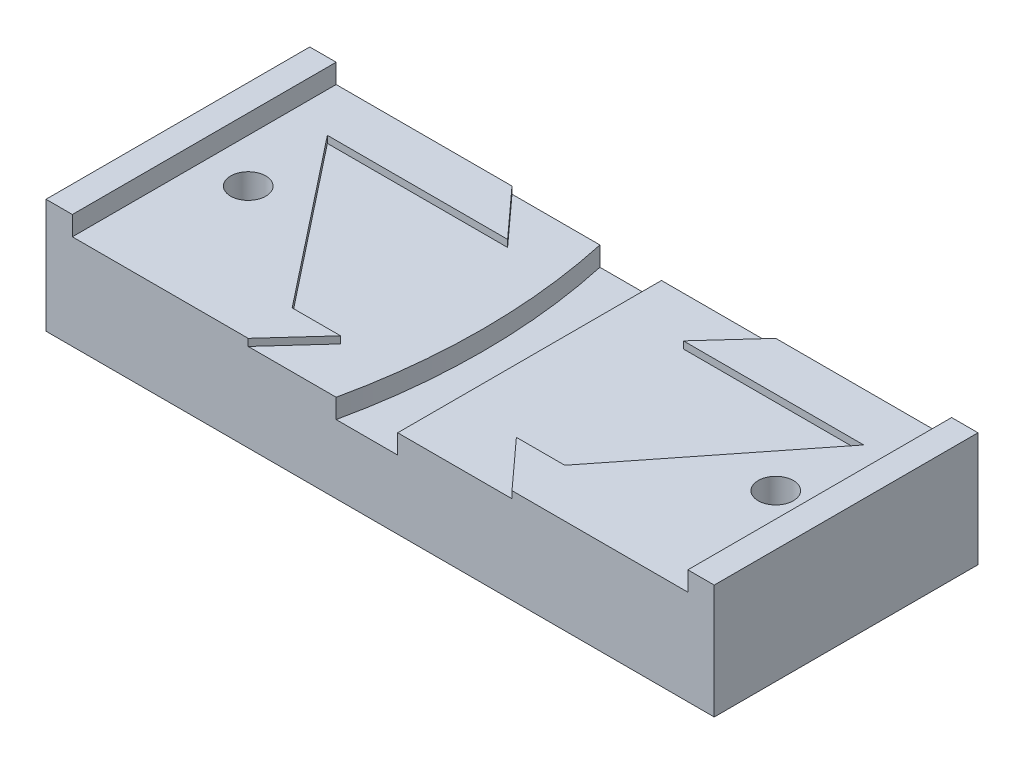
ISO-10303-21;
HEADER;
FILE_DESCRIPTION(('STEP AP214'),'2;1');
FILE_NAME('part.step','',(''),(''),'','','');
FILE_SCHEMA(('AUTOMOTIVE_DESIGN { 1 0 10303 214 1 1 1 1 }'));
ENDSEC;
DATA;
#1=APPLICATION_CONTEXT('core data for automotive mechanical design processes');
#2=APPLICATION_PROTOCOL_DEFINITION('international standard','automotive_design',2000,#1);
#3=PRODUCT_CONTEXT('',#1,'mechanical');
#4=PRODUCT('Part','Part','',(#3));
#5=PRODUCT_RELATED_PRODUCT_CATEGORY('part','',(#4));
#6=PRODUCT_DEFINITION_FORMATION('','',#4);
#7=PRODUCT_DEFINITION_CONTEXT('part definition',#1,'design');
#8=PRODUCT_DEFINITION('design','',#6,#7);
#9=PRODUCT_DEFINITION_SHAPE('','',#8);
#10=(LENGTH_UNIT() NAMED_UNIT(*) SI_UNIT(.MILLI.,.METRE.));
#11=(NAMED_UNIT(*) PLANE_ANGLE_UNIT() SI_UNIT($,.RADIAN.));
#12=(NAMED_UNIT(*) SI_UNIT($,.STERADIAN.) SOLID_ANGLE_UNIT());
#13=UNCERTAINTY_MEASURE_WITH_UNIT(LENGTH_MEASURE(1.E-05),#10,'distance_accuracy_value','');
#14=(GEOMETRIC_REPRESENTATION_CONTEXT(3) GLOBAL_UNCERTAINTY_ASSIGNED_CONTEXT((#13)) GLOBAL_UNIT_ASSIGNED_CONTEXT((#10,
#11,#12)) REPRESENTATION_CONTEXT('',''));
#15=CARTESIAN_POINT('',(0.,0.,0.));
#16=DIRECTION('',(0.,0.,1.));
#17=DIRECTION('',(1.,0.,0.));
#18=AXIS2_PLACEMENT_3D('',#15,#16,#17);
#19=CARTESIAN_POINT('',(0.,10.,0.));
#20=DIRECTION('',(0.,1.,0.));
#21=DIRECTION('',(0.,0.,1.));
#22=AXIS2_PLACEMENT_3D('',#19,#20,#21);
#23=PLANE('',#22);
#24=CARTESIAN_POINT('',(-73.3739716558867,10.,0.));
#25=DIRECTION('',(0.,-1.,0.));
#26=DIRECTION('',(0.,0.,-1.));
#27=AXIS2_PLACEMENT_3D('',#24,#25,#26);
#28=CIRCLE('',#27,70.);
#29=CARTESIAN_POINT('',(-5.,10.,-15.));
#30=VERTEX_POINT('',#29);
#31=CARTESIAN_POINT('',(-5.,10.,15.));
#32=VERTEX_POINT('',#31);
#33=EDGE_CURVE('E268',#30,#32,#28,.T.);
#34=ORIENTED_EDGE('',*,*,#33,.F.);
#35=DIRECTION('',(-1.,0.,0.));
#36=VECTOR('',#35,1.);
#37=CARTESIAN_POINT('',(35.,10.,-15.));
#38=LINE('',#37,#36);
#39=CARTESIAN_POINT('',(-15.,10.,-15.));
#40=VERTEX_POINT('',#39);
#41=EDGE_CURVE('E48',#30,#40,#38,.T.);
#42=ORIENTED_EDGE('',*,*,#41,.T.);
#43=DIRECTION('',(-0.672672793996312,0.,-0.739940073395944));
#44=VECTOR('',#43,1.);
#45=CARTESIAN_POINT('',(-0.746606334841628,10.,0.678733031674207));
#46=LINE('',#45,#44);
#47=CARTESIAN_POINT('',(-10.,10.,-9.50000000000001));
#48=VERTEX_POINT('',#47);
#49=EDGE_CURVE('E352',#48,#40,#46,.T.);
#50=ORIENTED_EDGE('',*,*,#49,.F.);
#51=DIRECTION('',(1.,0.,0.));
#52=VECTOR('',#51,1.);
#53=CARTESIAN_POINT('',(0.,10.,-9.50000000000001));
#54=LINE('',#53,#52);
#55=CARTESIAN_POINT('',(-30.5,10.,-9.50000000000001));
#56=VERTEX_POINT('',#55);
#57=EDGE_CURVE('E377',#56,#48,#54,.T.);
#58=ORIENTED_EDGE('',*,*,#57,.F.);
#59=DIRECTION('',(-0.619644288579021,0.,-0.784882765533426));
#60=VECTOR('',#59,1.);
#61=CARTESIAN_POINT('',(-14.1689419795222,10.,11.1860068259386));
#62=LINE('',#61,#60);
#63=CARTESIAN_POINT('',(-15.5,10.,9.5));
#64=VERTEX_POINT('',#63);
#65=EDGE_CURVE('E374',#64,#56,#62,.T.);
#66=ORIENTED_EDGE('',*,*,#65,.F.);
#67=DIRECTION('',(-1.,0.,0.));
#68=VECTOR('',#67,1.);
#69=CARTESIAN_POINT('',(0.,10.,9.49999999999999));
#70=LINE('',#69,#68);
#71=CARTESIAN_POINT('',(-10.,10.,9.5));
#72=VERTEX_POINT('',#71);
#73=EDGE_CURVE('E371',#72,#64,#70,.T.);
#74=ORIENTED_EDGE('',*,*,#73,.F.);
#75=DIRECTION('',(0.672672793996312,0.,-0.739940073395944));
#76=VECTOR('',#75,1.);
#77=CARTESIAN_POINT('',(-0.746606334841631,10.,-0.67873303167421));
#78=LINE('',#77,#76);
#79=CARTESIAN_POINT('',(-15.,10.,15.));
#80=VERTEX_POINT('',#79);
#81=EDGE_CURVE('E347',#80,#72,#78,.T.);
#82=ORIENTED_EDGE('',*,*,#81,.F.);
#83=DIRECTION('',(1.,0.,0.));
#84=VECTOR('',#83,1.);
#85=CARTESIAN_POINT('',(35.,10.,15.));
#86=LINE('',#85,#84);
#87=EDGE_CURVE('E400',#80,#32,#86,.T.);
#88=ORIENTED_EDGE('',*,*,#87,.T.);
#89=EDGE_LOOP('',(#34,#42,#50,#58,#66,#74,#82,#88));
#90=FACE_BOUND('',#89,.T.);
#91=ADVANCED_FACE('F39',(#90),#23,.T.);
#92=CARTESIAN_POINT('',(35.,10.,15.));
#93=DIRECTION('',(0.,0.,-1.));
#94=DIRECTION('',(-1.,0.,0.));
#95=AXIS2_PLACEMENT_3D('',#92,#93,#94);
#96=PLANE('',#95);
#97=DIRECTION('',(1.,0.,0.));
#98=VECTOR('',#97,1.);
#99=CARTESIAN_POINT('',(-5.,7.8,15.));
#100=LINE('',#99,#98);
#101=CARTESIAN_POINT('',(-5.,7.8,15.));
#102=VERTEX_POINT('',#101);
#103=CARTESIAN_POINT('',(2.,7.8,15.));
#104=VERTEX_POINT('',#103);
#105=EDGE_CURVE('E280',#102,#104,#100,.T.);
#106=ORIENTED_EDGE('',*,*,#105,.F.);
#107=DIRECTION('',(0.,1.,0.));
#108=VECTOR('',#107,1.);
#109=CARTESIAN_POINT('',(-5.,7.8,15.));
#110=LINE('',#109,#108);
#111=EDGE_CURVE('E290',#102,#32,#110,.T.);
#112=ORIENTED_EDGE('',*,*,#111,.T.);
#113=ORIENTED_EDGE('',*,*,#87,.F.);
#114=DIRECTION('',(0.,-1.,0.));
#115=VECTOR('',#114,1.);
#116=CARTESIAN_POINT('',(-15.,10.8,15.));
#117=LINE('',#116,#115);
#118=CARTESIAN_POINT('',(-15.,10.8,15.));
#119=VERTEX_POINT('',#118);
#120=EDGE_CURVE('E396',#119,#80,#117,.T.);
#121=ORIENTED_EDGE('',*,*,#120,.F.);
#122=DIRECTION('',(1.,0.,0.));
#123=VECTOR('',#122,1.);
#124=CARTESIAN_POINT('',(0.,10.8,15.));
#125=LINE('',#124,#123);
#126=CARTESIAN_POINT('',(-35.,10.8,15.));
#127=VERTEX_POINT('',#126);
#128=EDGE_CURVE('E348',#127,#119,#125,.T.);
#129=ORIENTED_EDGE('',*,*,#128,.F.);
#130=DIRECTION('',(0.,-1.,0.));
#131=VECTOR('',#130,1.);
#132=CARTESIAN_POINT('',(-35.,13.,15.));
#133=LINE('',#132,#131);
#134=CARTESIAN_POINT('',(-35.,13.,15.));
#135=VERTEX_POINT('',#134);
#136=EDGE_CURVE('E258',#135,#127,#133,.T.);
#137=ORIENTED_EDGE('',*,*,#136,.F.);
#138=DIRECTION('',(-1.,0.,0.));
#139=VECTOR('',#138,1.);
#140=CARTESIAN_POINT('',(0.,13.,15.));
#141=LINE('',#140,#139);
#142=CARTESIAN_POINT('',(-38.,13.,15.));
#143=VERTEX_POINT('',#142);
#144=EDGE_CURVE('E248',#135,#143,#141,.T.);
#145=ORIENTED_EDGE('',*,*,#144,.T.);
#146=DIRECTION('',(0.,-1.,0.));
#147=VECTOR('',#146,1.);
#148=CARTESIAN_POINT('',(-38.,13.,15.));
#149=LINE('',#148,#147);
#150=CARTESIAN_POINT('',(-38.,0.,15.));
#151=VERTEX_POINT('',#150);
#152=EDGE_CURVE('E254',#143,#151,#149,.T.);
#153=ORIENTED_EDGE('',*,*,#152,.T.);
#154=DIRECTION('',(1.,0.,0.));
#155=VECTOR('',#154,1.);
#156=CARTESIAN_POINT('',(35.,0.,15.));
#157=LINE('',#156,#155);
#158=CARTESIAN_POINT('',(38.,0.,15.));
#159=VERTEX_POINT('',#158);
#160=EDGE_CURVE('E399',#151,#159,#157,.T.);
#161=ORIENTED_EDGE('',*,*,#160,.T.);
#162=DIRECTION('',(0.,-1.,0.));
#163=VECTOR('',#162,1.);
#164=CARTESIAN_POINT('',(38.,13.,15.));
#165=LINE('',#164,#163);
#166=CARTESIAN_POINT('',(38.,13.,15.));
#167=VERTEX_POINT('',#166);
#168=EDGE_CURVE('E238',#167,#159,#165,.T.);
#169=ORIENTED_EDGE('',*,*,#168,.F.);
#170=DIRECTION('',(1.,0.,0.));
#171=VECTOR('',#170,1.);
#172=CARTESIAN_POINT('',(0.,13.,15.));
#173=LINE('',#172,#171);
#174=CARTESIAN_POINT('',(35.,13.,15.));
#175=VERTEX_POINT('',#174);
#176=EDGE_CURVE('E215',#175,#167,#173,.T.);
#177=ORIENTED_EDGE('',*,*,#176,.F.);
#178=DIRECTION('',(0.,-1.,0.));
#179=VECTOR('',#178,1.);
#180=CARTESIAN_POINT('',(35.,13.,15.));
#181=LINE('',#180,#179);
#182=CARTESIAN_POINT('',(35.,10.8,15.));
#183=VERTEX_POINT('',#182);
#184=EDGE_CURVE('E222',#175,#183,#181,.T.);
#185=ORIENTED_EDGE('',*,*,#184,.T.);
#186=DIRECTION('',(1.,0.,0.));
#187=VECTOR('',#186,1.);
#188=CARTESIAN_POINT('',(0.,10.8,15.));
#189=LINE('',#188,#187);
#190=CARTESIAN_POINT('',(15.,10.8,15.));
#191=VERTEX_POINT('',#190);
#192=EDGE_CURVE('E315',#191,#183,#189,.T.);
#193=ORIENTED_EDGE('',*,*,#192,.F.);
#194=DIRECTION('',(0.,-1.,0.));
#195=VECTOR('',#194,1.);
#196=CARTESIAN_POINT('',(15.,10.8,15.));
#197=LINE('',#196,#195);
#198=CARTESIAN_POINT('',(15.,10.,15.));
#199=VERTEX_POINT('',#198);
#200=EDGE_CURVE('E333',#191,#199,#197,.T.);
#201=ORIENTED_EDGE('',*,*,#200,.T.);
#202=CARTESIAN_POINT('',(2.,10.,15.));
#203=VERTEX_POINT('',#202);
#204=EDGE_CURVE('E402',#203,#199,#86,.T.);
#205=ORIENTED_EDGE('',*,*,#204,.F.);
#206=DIRECTION('',(0.,1.,0.));
#207=VECTOR('',#206,1.);
#208=CARTESIAN_POINT('',(2.,7.8,15.));
#209=LINE('',#208,#207);
#210=EDGE_CURVE('E56',#104,#203,#209,.T.);
#211=ORIENTED_EDGE('',*,*,#210,.F.);
#212=EDGE_LOOP('',(#106,#112,#113,#121,#129,#137,#145,#153,#161,#169,#177,#185,#193,#201,#205,#211));
#213=FACE_BOUND('',#212,.T.);
#214=ADVANCED_FACE('F41',(#213),#96,.F.);
#215=CARTESIAN_POINT('',(35.,10.,-15.));
#216=DIRECTION('',(0.,0.,1.));
#217=DIRECTION('',(1.,0.,0.));
#218=AXIS2_PLACEMENT_3D('',#215,#216,#217);
#219=PLANE('',#218);
#220=ORIENTED_EDGE('',*,*,#41,.F.);
#221=DIRECTION('',(0.,1.,0.));
#222=VECTOR('',#221,1.);
#223=CARTESIAN_POINT('',(-5.,7.8,-15.));
#224=LINE('',#223,#222);
#225=CARTESIAN_POINT('',(-5.,7.8,-15.));
#226=VERTEX_POINT('',#225);
#227=EDGE_CURVE('E293',#226,#30,#224,.T.);
#228=ORIENTED_EDGE('',*,*,#227,.F.);
#229=DIRECTION('',(-1.,0.,0.));
#230=VECTOR('',#229,1.);
#231=CARTESIAN_POINT('',(-5.,7.8,-15.));
#232=LINE('',#231,#230);
#233=CARTESIAN_POINT('',(2.,7.8,-15.));
#234=VERTEX_POINT('',#233);
#235=EDGE_CURVE('E287',#234,#226,#232,.T.);
#236=ORIENTED_EDGE('',*,*,#235,.F.);
#237=DIRECTION('',(0.,1.,0.));
#238=VECTOR('',#237,1.);
#239=CARTESIAN_POINT('',(2.,7.8,-15.));
#240=LINE('',#239,#238);
#241=CARTESIAN_POINT('',(2.,10.,-15.));
#242=VERTEX_POINT('',#241);
#243=EDGE_CURVE('E296',#234,#242,#240,.T.);
#244=ORIENTED_EDGE('',*,*,#243,.T.);
#245=CARTESIAN_POINT('',(15.,10.,-15.));
#246=VERTEX_POINT('',#245);
#247=EDGE_CURVE('E11',#246,#242,#38,.T.);
#248=ORIENTED_EDGE('',*,*,#247,.F.);
#249=DIRECTION('',(0.,-1.,0.));
#250=VECTOR('',#249,1.);
#251=CARTESIAN_POINT('',(15.,10.8,-15.));
#252=LINE('',#251,#250);
#253=CARTESIAN_POINT('',(15.,10.8,-15.));
#254=VERTEX_POINT('',#253);
#255=EDGE_CURVE('E321',#254,#246,#252,.T.);
#256=ORIENTED_EDGE('',*,*,#255,.F.);
#257=DIRECTION('',(-1.,0.,0.));
#258=VECTOR('',#257,1.);
#259=CARTESIAN_POINT('',(0.,10.8,-15.));
#260=LINE('',#259,#258);
#261=CARTESIAN_POINT('',(35.,10.8,-15.));
#262=VERTEX_POINT('',#261);
#263=EDGE_CURVE('E211',#262,#254,#260,.T.);
#264=ORIENTED_EDGE('',*,*,#263,.F.);
#265=DIRECTION('',(0.,-1.,0.));
#266=VECTOR('',#265,1.);
#267=CARTESIAN_POINT('',(35.,13.,-15.));
#268=LINE('',#267,#266);
#269=CARTESIAN_POINT('',(35.,13.,-15.));
#270=VERTEX_POINT('',#269);
#271=EDGE_CURVE('E203',#270,#262,#268,.T.);
#272=ORIENTED_EDGE('',*,*,#271,.F.);
#273=DIRECTION('',(1.,0.,0.));
#274=VECTOR('',#273,1.);
#275=CARTESIAN_POINT('',(0.,13.,-15.));
#276=LINE('',#275,#274);
#277=CARTESIAN_POINT('',(38.,13.,-15.));
#278=VERTEX_POINT('',#277);
#279=EDGE_CURVE('E209',#270,#278,#276,.T.);
#280=ORIENTED_EDGE('',*,*,#279,.T.);
#281=DIRECTION('',(0.,-1.,0.));
#282=VECTOR('',#281,1.);
#283=CARTESIAN_POINT('',(38.,13.,-15.));
#284=LINE('',#283,#282);
#285=CARTESIAN_POINT('',(38.,0.,-15.));
#286=VERTEX_POINT('',#285);
#287=EDGE_CURVE('E214',#278,#286,#284,.T.);
#288=ORIENTED_EDGE('',*,*,#287,.T.);
#289=DIRECTION('',(-1.,0.,0.));
#290=VECTOR('',#289,1.);
#291=CARTESIAN_POINT('',(35.,0.,-15.));
#292=LINE('',#291,#290);
#293=CARTESIAN_POINT('',(-38.,0.,-15.));
#294=VERTEX_POINT('',#293);
#295=EDGE_CURVE('E43',#286,#294,#292,.T.);
#296=ORIENTED_EDGE('',*,*,#295,.T.);
#297=DIRECTION('',(0.,-1.,0.));
#298=VECTOR('',#297,1.);
#299=CARTESIAN_POINT('',(-38.,13.,-15.));
#300=LINE('',#299,#298);
#301=CARTESIAN_POINT('',(-38.,13.,-15.));
#302=VERTEX_POINT('',#301);
#303=EDGE_CURVE('E251',#302,#294,#300,.T.);
#304=ORIENTED_EDGE('',*,*,#303,.F.);
#305=DIRECTION('',(-1.,0.,0.));
#306=VECTOR('',#305,1.);
#307=CARTESIAN_POINT('',(0.,13.,-15.));
#308=LINE('',#307,#306);
#309=CARTESIAN_POINT('',(-35.,13.,-15.));
#310=VERTEX_POINT('',#309);
#311=EDGE_CURVE('E244',#310,#302,#308,.T.);
#312=ORIENTED_EDGE('',*,*,#311,.F.);
#313=DIRECTION('',(0.,-1.,0.));
#314=VECTOR('',#313,1.);
#315=CARTESIAN_POINT('',(-35.,13.,-15.));
#316=LINE('',#315,#314);
#317=CARTESIAN_POINT('',(-35.,10.8,-15.));
#318=VERTEX_POINT('',#317);
#319=EDGE_CURVE('E260',#310,#318,#316,.T.);
#320=ORIENTED_EDGE('',*,*,#319,.T.);
#321=DIRECTION('',(-1.,0.,0.));
#322=VECTOR('',#321,1.);
#323=CARTESIAN_POINT('',(0.,10.8,-15.));
#324=LINE('',#323,#322);
#325=CARTESIAN_POINT('',(-15.,10.8,-15.));
#326=VERTEX_POINT('',#325);
#327=EDGE_CURVE('E362',#326,#318,#324,.T.);
#328=ORIENTED_EDGE('',*,*,#327,.F.);
#329=DIRECTION('',(0.,-1.,0.));
#330=VECTOR('',#329,1.);
#331=CARTESIAN_POINT('',(-15.,10.8,-15.));
#332=LINE('',#331,#330);
#333=EDGE_CURVE('E368',#326,#40,#332,.T.);
#334=ORIENTED_EDGE('',*,*,#333,.T.);
#335=EDGE_LOOP('',(#220,#228,#236,#244,#248,#256,#264,#272,#280,#288,#296,#304,#312,#320,#328,#334));
#336=FACE_BOUND('',#335,.T.);
#337=ADVANCED_FACE('F206',(#336),#219,.F.);
#338=DIRECTION('',(0.,0.,-1.));
#339=VECTOR('',#338,1.);
#340=CARTESIAN_POINT('',(2.,10.,-15.));
#341=LINE('',#340,#339);
#342=EDGE_CURVE('E281',#203,#242,#341,.T.);
#343=ORIENTED_EDGE('',*,*,#342,.F.);
#344=ORIENTED_EDGE('',*,*,#204,.T.);
#345=DIRECTION('',(-0.672672793996313,0.,-0.739940073395944));
#346=VECTOR('',#345,1.);
#347=CARTESIAN_POINT('',(0.74660633484163,10.,-0.678733031674209));
#348=LINE('',#347,#346);
#349=CARTESIAN_POINT('',(10.,10.,9.49999999999999));
#350=VERTEX_POINT('',#349);
#351=EDGE_CURVE('E306',#199,#350,#348,.T.);
#352=ORIENTED_EDGE('',*,*,#351,.T.);
#353=DIRECTION('',(-1.,0.,0.));
#354=VECTOR('',#353,1.);
#355=CARTESIAN_POINT('',(0.,10.,9.49999999999999));
#356=LINE('',#355,#354);
#357=CARTESIAN_POINT('',(15.5,10.,9.49999999999999));
#358=VERTEX_POINT('',#357);
#359=EDGE_CURVE('E327',#358,#350,#356,.T.);
#360=ORIENTED_EDGE('',*,*,#359,.F.);
#361=DIRECTION('',(-0.619644288579021,0.,0.784882765533427));
#362=VECTOR('',#361,1.);
#363=CARTESIAN_POINT('',(14.1689419795222,10.,11.1860068259386));
#364=LINE('',#363,#362);
#365=CARTESIAN_POINT('',(30.5,10.,-9.50000000000001));
#366=VERTEX_POINT('',#365);
#367=EDGE_CURVE('E324',#366,#358,#364,.T.);
#368=ORIENTED_EDGE('',*,*,#367,.F.);
#369=DIRECTION('',(1.,0.,0.));
#370=VECTOR('',#369,1.);
#371=CARTESIAN_POINT('',(0.,10.,-9.50000000000001));
#372=LINE('',#371,#370);
#373=CARTESIAN_POINT('',(10.,10.,-9.50000000000001));
#374=VERTEX_POINT('',#373);
#375=EDGE_CURVE('E64',#374,#366,#372,.T.);
#376=ORIENTED_EDGE('',*,*,#375,.F.);
#377=DIRECTION('',(0.672672793996312,0.,-0.739940073395944));
#378=VECTOR('',#377,1.);
#379=CARTESIAN_POINT('',(0.746606334841628,10.,0.678733031674207));
#380=LINE('',#379,#378);
#381=EDGE_CURVE('E295',#374,#246,#380,.T.);
#382=ORIENTED_EDGE('',*,*,#381,.T.);
#383=ORIENTED_EDGE('',*,*,#247,.T.);
#384=EDGE_LOOP('',(#343,#344,#352,#360,#368,#376,#382,#383));
#385=FACE_BOUND('',#384,.T.);
#386=ADVANCED_FACE('F407',(#385),#23,.T.);
#387=CARTESIAN_POINT('',(0.,0.,0.));
#388=DIRECTION('',(0.,1.,0.));
#389=DIRECTION('',(0.,0.,1.));
#390=AXIS2_PLACEMENT_3D('',#387,#388,#389);
#391=PLANE('',#390);
#392=ORIENTED_EDGE('',*,*,#160,.F.);
#393=DIRECTION('',(0.,0.,1.));
#394=VECTOR('',#393,1.);
#395=CARTESIAN_POINT('',(-38.,0.,0.));
#396=LINE('',#395,#394);
#397=EDGE_CURVE('E237',#294,#151,#396,.T.);
#398=ORIENTED_EDGE('',*,*,#397,.F.);
#399=ORIENTED_EDGE('',*,*,#295,.F.);
#400=DIRECTION('',(0.,0.,1.));
#401=VECTOR('',#400,1.);
#402=CARTESIAN_POINT('',(38.,0.,0.));
#403=LINE('',#402,#401);
#404=EDGE_CURVE('E224',#286,#159,#403,.T.);
#405=ORIENTED_EDGE('',*,*,#404,.T.);
#406=EDGE_LOOP('',(#392,#398,#399,#405));
#407=FACE_BOUND('',#406,.T.);
#408=ADVANCED_FACE('F466',(#407),#391,.F.);
#409=CARTESIAN_POINT('',(-0.746606334841631,10.8,-0.67873303167421));
#410=DIRECTION('',(-0.739940073395944,0.,-0.672672793996312));
#411=DIRECTION('',(-0.672672793996312,0.,0.739940073395944));
#412=AXIS2_PLACEMENT_3D('',#409,#410,#411);
#413=PLANE('',#412);
#414=ORIENTED_EDGE('',*,*,#81,.T.);
#415=DIRECTION('',(0.,-1.,0.));
#416=VECTOR('',#415,1.);
#417=CARTESIAN_POINT('',(-10.,10.8,9.5));
#418=LINE('',#417,#416);
#419=CARTESIAN_POINT('',(-10.,10.8,9.5));
#420=VERTEX_POINT('',#419);
#421=EDGE_CURVE('E393',#420,#72,#418,.T.);
#422=ORIENTED_EDGE('',*,*,#421,.F.);
#423=DIRECTION('',(0.672672793996312,0.,-0.739940073395944));
#424=VECTOR('',#423,1.);
#425=CARTESIAN_POINT('',(-0.746606334841631,10.8,-0.67873303167421));
#426=LINE('',#425,#424);
#427=EDGE_CURVE('E351',#119,#420,#426,.T.);
#428=ORIENTED_EDGE('',*,*,#427,.F.);
#429=ORIENTED_EDGE('',*,*,#120,.T.);
#430=EDGE_LOOP('',(#414,#422,#428,#429));
#431=FACE_BOUND('',#430,.T.);
#432=ADVANCED_FACE('F442',(#431),#413,.F.);
#433=CARTESIAN_POINT('',(0.,10.8,9.49999999999999));
#434=DIRECTION('',(0.,0.,1.));
#435=DIRECTION('',(1.,0.,0.));
#436=AXIS2_PLACEMENT_3D('',#433,#434,#435);
#437=PLANE('',#436);
#438=ORIENTED_EDGE('',*,*,#73,.T.);
#439=DIRECTION('',(0.,-1.,0.));
#440=VECTOR('',#439,1.);
#441=CARTESIAN_POINT('',(-15.5,10.8,9.5));
#442=LINE('',#441,#440);
#443=CARTESIAN_POINT('',(-15.5,10.8,9.5));
#444=VERTEX_POINT('',#443);
#445=EDGE_CURVE('E390',#444,#64,#442,.T.);
#446=ORIENTED_EDGE('',*,*,#445,.F.);
#447=DIRECTION('',(-1.,0.,0.));
#448=VECTOR('',#447,1.);
#449=CARTESIAN_POINT('',(0.,10.8,9.49999999999999));
#450=LINE('',#449,#448);
#451=EDGE_CURVE('E354',#420,#444,#450,.T.);
#452=ORIENTED_EDGE('',*,*,#451,.F.);
#453=ORIENTED_EDGE('',*,*,#421,.T.);
#454=EDGE_LOOP('',(#438,#446,#452,#453));
#455=FACE_BOUND('',#454,.T.);
#456=ADVANCED_FACE('F445',(#455),#437,.F.);
#457=CARTESIAN_POINT('',(-14.1689419795222,10.8,11.1860068259386));
#458=DIRECTION('',(-0.784882765533426,0.,0.619644288579021));
#459=DIRECTION('',(0.619644288579021,0.,0.784882765533426));
#460=AXIS2_PLACEMENT_3D('',#457,#458,#459);
#461=PLANE('',#460);
#462=ORIENTED_EDGE('',*,*,#65,.T.);
#463=DIRECTION('',(0.,-1.,0.));
#464=VECTOR('',#463,1.);
#465=CARTESIAN_POINT('',(-30.5,10.8,-9.50000000000001));
#466=LINE('',#465,#464);
#467=CARTESIAN_POINT('',(-30.5,10.8,-9.50000000000001));
#468=VERTEX_POINT('',#467);
#469=EDGE_CURVE('E387',#468,#56,#466,.T.);
#470=ORIENTED_EDGE('',*,*,#469,.F.);
#471=DIRECTION('',(-0.619644288579021,0.,-0.784882765533426));
#472=VECTOR('',#471,1.);
#473=CARTESIAN_POINT('',(-14.1689419795222,10.8,11.1860068259386));
#474=LINE('',#473,#472);
#475=EDGE_CURVE('E356',#444,#468,#474,.T.);
#476=ORIENTED_EDGE('',*,*,#475,.F.);
#477=ORIENTED_EDGE('',*,*,#445,.T.);
#478=EDGE_LOOP('',(#462,#470,#476,#477));
#479=FACE_BOUND('',#478,.T.);
#480=ADVANCED_FACE('F653',(#479),#461,.F.);
#481=CARTESIAN_POINT('',(0.,10.8,-9.50000000000001));
#482=DIRECTION('',(0.,0.,-1.));
#483=DIRECTION('',(-1.,0.,0.));
#484=AXIS2_PLACEMENT_3D('',#481,#482,#483);
#485=PLANE('',#484);
#486=ORIENTED_EDGE('',*,*,#57,.T.);
#487=DIRECTION('',(0.,-1.,0.));
#488=VECTOR('',#487,1.);
#489=CARTESIAN_POINT('',(-10.,10.8,-9.50000000000001));
#490=LINE('',#489,#488);
#491=CARTESIAN_POINT('',(-10.,10.8,-9.50000000000001));
#492=VERTEX_POINT('',#491);
#493=EDGE_CURVE('E384',#492,#48,#490,.T.);
#494=ORIENTED_EDGE('',*,*,#493,.F.);
#495=DIRECTION('',(1.,0.,0.));
#496=VECTOR('',#495,1.);
#497=CARTESIAN_POINT('',(0.,10.8,-9.50000000000001));
#498=LINE('',#497,#496);
#499=EDGE_CURVE('E358',#468,#492,#498,.T.);
#500=ORIENTED_EDGE('',*,*,#499,.F.);
#501=ORIENTED_EDGE('',*,*,#469,.T.);
#502=EDGE_LOOP('',(#486,#494,#500,#501));
#503=FACE_BOUND('',#502,.T.);
#504=ADVANCED_FACE('F642',(#503),#485,.F.);
#505=CARTESIAN_POINT('',(-0.746606334841628,10.8,0.678733031674207));
#506=DIRECTION('',(-0.739940073395944,0.,0.672672793996312));
#507=DIRECTION('',(0.672672793996312,0.,0.739940073395944));
#508=AXIS2_PLACEMENT_3D('',#505,#506,#507);
#509=PLANE('',#508);
#510=ORIENTED_EDGE('',*,*,#49,.T.);
#511=ORIENTED_EDGE('',*,*,#333,.F.);
#512=DIRECTION('',(-0.672672793996312,0.,-0.739940073395944));
#513=VECTOR('',#512,1.);
#514=CARTESIAN_POINT('',(-0.746606334841628,10.8,0.678733031674207));
#515=LINE('',#514,#513);
#516=EDGE_CURVE('E360',#492,#326,#515,.T.);
#517=ORIENTED_EDGE('',*,*,#516,.F.);
#518=ORIENTED_EDGE('',*,*,#493,.T.);
#519=EDGE_LOOP('',(#510,#511,#517,#518));
#520=FACE_BOUND('',#519,.T.);
#521=ADVANCED_FACE('F637',(#520),#509,.F.);
#522=CARTESIAN_POINT('',(0.,10.8,0.));
#523=DIRECTION('',(0.,1.,0.));
#524=DIRECTION('',(0.,0.,1.));
#525=AXIS2_PLACEMENT_3D('',#522,#523,#524);
#526=PLANE('',#525);
#527=CARTESIAN_POINT('',(-30.,10.8,0.));
#528=DIRECTION('',(0.,1.,0.));
#529=DIRECTION('',(0.,0.,1.));
#530=AXIS2_PLACEMENT_3D('',#527,#528,#529);
#531=CIRCLE('',#530,2.);
#532=CARTESIAN_POINT('',(-30.,10.8,2.));
#533=VERTEX_POINT('',#532);
#534=EDGE_CURVE('E269',#533,#533,#531,.T.);
#535=ORIENTED_EDGE('',*,*,#534,.F.);
#536=EDGE_LOOP('',(#535));
#537=FACE_BOUND('',#536,.T.);
#538=ORIENTED_EDGE('',*,*,#128,.T.);
#539=ORIENTED_EDGE('',*,*,#427,.T.);
#540=ORIENTED_EDGE('',*,*,#451,.T.);
#541=ORIENTED_EDGE('',*,*,#475,.T.);
#542=ORIENTED_EDGE('',*,*,#499,.T.);
#543=ORIENTED_EDGE('',*,*,#516,.T.);
#544=ORIENTED_EDGE('',*,*,#327,.T.);
#545=DIRECTION('',(0.,0.,1.));
#546=VECTOR('',#545,1.);
#547=CARTESIAN_POINT('',(-35.,10.8,0.));
#548=LINE('',#547,#546);
#549=EDGE_CURVE('E365',#318,#127,#548,.T.);
#550=ORIENTED_EDGE('',*,*,#549,.T.);
#551=EDGE_LOOP('',(#538,#539,#540,#541,#542,#543,#544,#550));
#552=FACE_BOUND('',#551,.T.);
#553=ADVANCED_FACE('F449',(#537,#552),#526,.T.);
#554=CARTESIAN_POINT('',(0.746606334841628,10.8,0.678733031674207));
#555=DIRECTION('',(-0.739940073395944,0.,-0.672672793996312));
#556=DIRECTION('',(-0.672672793996312,0.,0.739940073395944));
#557=AXIS2_PLACEMENT_3D('',#554,#555,#556);
#558=PLANE('',#557);
#559=ORIENTED_EDGE('',*,*,#381,.F.);
#560=DIRECTION('',(0.,-1.,0.));
#561=VECTOR('',#560,1.);
#562=CARTESIAN_POINT('',(10.,10.8,-9.50000000000001));
#563=LINE('',#562,#561);
#564=CARTESIAN_POINT('',(10.,10.8,-9.50000000000001));
#565=VERTEX_POINT('',#564);
#566=EDGE_CURVE('E345',#565,#374,#563,.T.);
#567=ORIENTED_EDGE('',*,*,#566,.F.);
#568=DIRECTION('',(0.672672793996312,0.,-0.739940073395944));
#569=VECTOR('',#568,1.);
#570=CARTESIAN_POINT('',(0.746606334841628,10.8,0.678733031674207));
#571=LINE('',#570,#569);
#572=EDGE_CURVE('E302',#565,#254,#571,.T.);
#573=ORIENTED_EDGE('',*,*,#572,.T.);
#574=ORIENTED_EDGE('',*,*,#255,.T.);
#575=EDGE_LOOP('',(#559,#567,#573,#574));
#576=FACE_BOUND('',#575,.T.);
#577=ADVANCED_FACE('F429',(#576),#558,.T.);
#578=CARTESIAN_POINT('',(0.,10.8,-9.50000000000001));
#579=DIRECTION('',(0.,0.,-1.));
#580=DIRECTION('',(-1.,0.,0.));
#581=AXIS2_PLACEMENT_3D('',#578,#579,#580);
#582=PLANE('',#581);
#583=ORIENTED_EDGE('',*,*,#375,.T.);
#584=DIRECTION('',(0.,-1.,0.));
#585=VECTOR('',#584,1.);
#586=CARTESIAN_POINT('',(30.5,10.8,-9.50000000000001));
#587=LINE('',#586,#585);
#588=CARTESIAN_POINT('',(30.5,10.8,-9.50000000000001));
#589=VERTEX_POINT('',#588);
#590=EDGE_CURVE('E342',#589,#366,#587,.T.);
#591=ORIENTED_EDGE('',*,*,#590,.F.);
#592=DIRECTION('',(1.,0.,0.));
#593=VECTOR('',#592,1.);
#594=CARTESIAN_POINT('',(0.,10.8,-9.50000000000001));
#595=LINE('',#594,#593);
#596=EDGE_CURVE('E305',#565,#589,#595,.T.);
#597=ORIENTED_EDGE('',*,*,#596,.F.);
#598=ORIENTED_EDGE('',*,*,#566,.T.);
#599=EDGE_LOOP('',(#583,#591,#597,#598));
#600=FACE_BOUND('',#599,.T.);
#601=ADVANCED_FACE('F425',(#600),#582,.F.);
#602=CARTESIAN_POINT('',(14.1689419795222,10.8,11.1860068259386));
#603=DIRECTION('',(0.784882765533426,0.,0.619644288579021));
#604=DIRECTION('',(0.619644288579021,0.,-0.784882765533426));
#605=AXIS2_PLACEMENT_3D('',#602,#603,#604);
#606=PLANE('',#605);
#607=ORIENTED_EDGE('',*,*,#367,.T.);
#608=DIRECTION('',(0.,-1.,0.));
#609=VECTOR('',#608,1.);
#610=CARTESIAN_POINT('',(15.5,10.8,9.49999999999999));
#611=LINE('',#610,#609);
#612=CARTESIAN_POINT('',(15.5,10.8,9.49999999999999));
#613=VERTEX_POINT('',#612);
#614=EDGE_CURVE('E339',#613,#358,#611,.T.);
#615=ORIENTED_EDGE('',*,*,#614,.F.);
#616=DIRECTION('',(-0.619644288579021,0.,0.784882765533427));
#617=VECTOR('',#616,1.);
#618=CARTESIAN_POINT('',(14.1689419795222,10.8,11.1860068259386));
#619=LINE('',#618,#617);
#620=EDGE_CURVE('E308',#589,#613,#619,.T.);
#621=ORIENTED_EDGE('',*,*,#620,.F.);
#622=ORIENTED_EDGE('',*,*,#590,.T.);
#623=EDGE_LOOP('',(#607,#615,#621,#622));
#624=FACE_BOUND('',#623,.T.);
#625=ADVANCED_FACE('F420',(#624),#606,.F.);
#626=CARTESIAN_POINT('',(0.,10.8,9.49999999999999));
#627=DIRECTION('',(0.,0.,1.));
#628=DIRECTION('',(1.,0.,0.));
#629=AXIS2_PLACEMENT_3D('',#626,#627,#628);
#630=PLANE('',#629);
#631=ORIENTED_EDGE('',*,*,#359,.T.);
#632=DIRECTION('',(0.,-1.,0.));
#633=VECTOR('',#632,1.);
#634=CARTESIAN_POINT('',(10.,10.8,9.49999999999999));
#635=LINE('',#634,#633);
#636=CARTESIAN_POINT('',(10.,10.8,9.49999999999999));
#637=VERTEX_POINT('',#636);
#638=EDGE_CURVE('E336',#637,#350,#635,.T.);
#639=ORIENTED_EDGE('',*,*,#638,.F.);
#640=DIRECTION('',(-1.,0.,0.));
#641=VECTOR('',#640,1.);
#642=CARTESIAN_POINT('',(0.,10.8,9.49999999999999));
#643=LINE('',#642,#641);
#644=EDGE_CURVE('E310',#613,#637,#643,.T.);
#645=ORIENTED_EDGE('',*,*,#644,.F.);
#646=ORIENTED_EDGE('',*,*,#614,.T.);
#647=EDGE_LOOP('',(#631,#639,#645,#646));
#648=FACE_BOUND('',#647,.T.);
#649=ADVANCED_FACE('F417',(#648),#630,.F.);
#650=CARTESIAN_POINT('',(0.74660633484163,10.8,-0.678733031674209));
#651=DIRECTION('',(-0.739940073395943,0.,0.672672793996313));
#652=DIRECTION('',(0.672672793996313,0.,0.739940073395943));
#653=AXIS2_PLACEMENT_3D('',#650,#651,#652);
#654=PLANE('',#653);
#655=ORIENTED_EDGE('',*,*,#351,.F.);
#656=ORIENTED_EDGE('',*,*,#200,.F.);
#657=DIRECTION('',(-0.672672793996313,0.,-0.739940073395944));
#658=VECTOR('',#657,1.);
#659=CARTESIAN_POINT('',(0.74660633484163,10.8,-0.678733031674209));
#660=LINE('',#659,#658);
#661=EDGE_CURVE('E312',#191,#637,#660,.T.);
#662=ORIENTED_EDGE('',*,*,#661,.T.);
#663=ORIENTED_EDGE('',*,*,#638,.T.);
#664=EDGE_LOOP('',(#655,#656,#662,#663));
#665=FACE_BOUND('',#664,.T.);
#666=ADVANCED_FACE('F413',(#665),#654,.T.);
#667=CARTESIAN_POINT('',(0.,10.8,0.));
#668=DIRECTION('',(0.,1.,0.));
#669=DIRECTION('',(0.,0.,1.));
#670=AXIS2_PLACEMENT_3D('',#667,#668,#669);
#671=PLANE('',#670);
#672=CARTESIAN_POINT('',(30.,10.8,0.));
#673=DIRECTION('',(0.,1.,0.));
#674=DIRECTION('',(0.,0.,1.));
#675=AXIS2_PLACEMENT_3D('',#672,#673,#674);
#676=CIRCLE('',#675,2.);
#677=CARTESIAN_POINT('',(30.,10.8,1.99999999999999));
#678=VERTEX_POINT('',#677);
#679=EDGE_CURVE('E272',#678,#678,#676,.T.);
#680=ORIENTED_EDGE('',*,*,#679,.F.);
#681=EDGE_LOOP('',(#680));
#682=FACE_BOUND('',#681,.T.);
#683=ORIENTED_EDGE('',*,*,#572,.F.);
#684=ORIENTED_EDGE('',*,*,#596,.T.);
#685=ORIENTED_EDGE('',*,*,#620,.T.);
#686=ORIENTED_EDGE('',*,*,#644,.T.);
#687=ORIENTED_EDGE('',*,*,#661,.F.);
#688=ORIENTED_EDGE('',*,*,#192,.T.);
#689=DIRECTION('',(0.,0.,-1.));
#690=VECTOR('',#689,1.);
#691=CARTESIAN_POINT('',(35.,10.8,0.));
#692=LINE('',#691,#690);
#693=EDGE_CURVE('E318',#183,#262,#692,.T.);
#694=ORIENTED_EDGE('',*,*,#693,.T.);
#695=ORIENTED_EDGE('',*,*,#263,.T.);
#696=EDGE_LOOP('',(#683,#684,#685,#686,#687,#688,#694,#695));
#697=FACE_BOUND('',#696,.T.);
#698=ADVANCED_FACE('F471',(#682,#697),#671,.T.);
#699=CARTESIAN_POINT('',(-73.3739716558867,7.8,0.));
#700=DIRECTION('',(0.,1.,0.));
#701=DIRECTION('',(0.,0.,1.));
#702=AXIS2_PLACEMENT_3D('',#699,#700,#701);
#703=CYLINDRICAL_SURFACE('',#702,70.);
#704=ORIENTED_EDGE('',*,*,#33,.T.);
#705=ORIENTED_EDGE('',*,*,#111,.F.);
#706=CARTESIAN_POINT('',(-73.3739716558867,7.8,0.));
#707=DIRECTION('',(0.,-1.,0.));
#708=DIRECTION('',(0.,0.,-1.));
#709=AXIS2_PLACEMENT_3D('',#706,#707,#708);
#710=CIRCLE('',#709,70.);
#711=EDGE_CURVE('E277',#226,#102,#710,.T.);
#712=ORIENTED_EDGE('',*,*,#711,.F.);
#713=ORIENTED_EDGE('',*,*,#227,.T.);
#714=EDGE_LOOP('',(#704,#705,#712,#713));
#715=FACE_BOUND('',#714,.T.);
#716=ADVANCED_FACE('F473',(#715),#703,.T.);
#717=CARTESIAN_POINT('',(2.,7.8,-15.));
#718=DIRECTION('',(1.,0.,0.));
#719=DIRECTION('',(0.,0.,-1.));
#720=AXIS2_PLACEMENT_3D('',#717,#718,#719);
#721=PLANE('',#720);
#722=ORIENTED_EDGE('',*,*,#342,.T.);
#723=ORIENTED_EDGE('',*,*,#243,.F.);
#724=DIRECTION('',(0.,0.,-1.));
#725=VECTOR('',#724,1.);
#726=CARTESIAN_POINT('',(2.,7.8,-15.));
#727=LINE('',#726,#725);
#728=EDGE_CURVE('E284',#104,#234,#727,.T.);
#729=ORIENTED_EDGE('',*,*,#728,.F.);
#730=ORIENTED_EDGE('',*,*,#210,.T.);
#731=EDGE_LOOP('',(#722,#723,#729,#730));
#732=FACE_BOUND('',#731,.T.);
#733=ADVANCED_FACE('F432',(#732),#721,.F.);
#734=CARTESIAN_POINT('',(-73.3739716558867,7.8,0.));
#735=DIRECTION('',(0.,-1.,0.));
#736=DIRECTION('',(0.,0.,-1.));
#737=AXIS2_PLACEMENT_3D('',#734,#735,#736);
#738=PLANE('',#737);
#739=ORIENTED_EDGE('',*,*,#711,.T.);
#740=ORIENTED_EDGE('',*,*,#105,.T.);
#741=ORIENTED_EDGE('',*,*,#728,.T.);
#742=ORIENTED_EDGE('',*,*,#235,.T.);
#743=EDGE_LOOP('',(#739,#740,#741,#742));
#744=FACE_BOUND('',#743,.T.);
#745=ADVANCED_FACE('F434',(#744),#738,.F.);
#746=CARTESIAN_POINT('',(30.,2.8,0.));
#747=DIRECTION('',(0.,1.,0.));
#748=DIRECTION('',(0.,0.,1.));
#749=AXIS2_PLACEMENT_3D('',#746,#747,#748);
#750=CYLINDRICAL_SURFACE('',#749,2.);
#751=CARTESIAN_POINT('',(30.,2.8,0.));
#752=DIRECTION('',(0.,1.,0.));
#753=DIRECTION('',(0.,0.,1.));
#754=AXIS2_PLACEMENT_3D('',#751,#752,#753);
#755=CIRCLE('',#754,2.);
#756=CARTESIAN_POINT('',(30.,2.8,1.99999999999999));
#757=VERTEX_POINT('',#756);
#758=EDGE_CURVE('E257',#757,#757,#755,.T.);
#759=ORIENTED_EDGE('',*,*,#758,.F.);
#760=EDGE_LOOP('',(#759));
#761=FACE_BOUND('',#760,.T.);
#762=ORIENTED_EDGE('',*,*,#679,.T.);
#763=EDGE_LOOP('',(#762));
#764=FACE_BOUND('',#763,.T.);
#765=ADVANCED_FACE('F537',(#761,#764),#750,.F.);
#766=CARTESIAN_POINT('',(30.,2.8,0.));
#767=DIRECTION('',(0.,1.,0.));
#768=DIRECTION('',(0.,0.,1.));
#769=AXIS2_PLACEMENT_3D('',#766,#767,#768);
#770=PLANE('',#769);
#771=ORIENTED_EDGE('',*,*,#758,.T.);
#772=EDGE_LOOP('',(#771));
#773=FACE_BOUND('',#772,.T.);
#774=ADVANCED_FACE('F526',(#773),#770,.T.);
#775=CARTESIAN_POINT('',(-30.,2.8,0.));
#776=DIRECTION('',(0.,1.,0.));
#777=DIRECTION('',(0.,0.,1.));
#778=AXIS2_PLACEMENT_3D('',#775,#776,#777);
#779=CYLINDRICAL_SURFACE('',#778,2.);
#780=CARTESIAN_POINT('',(-30.,2.8,0.));
#781=DIRECTION('',(0.,1.,0.));
#782=DIRECTION('',(0.,0.,1.));
#783=AXIS2_PLACEMENT_3D('',#780,#781,#782);
#784=CIRCLE('',#783,2.);
#785=CARTESIAN_POINT('',(-30.,2.8,2.));
#786=VERTEX_POINT('',#785);
#787=EDGE_CURVE('E265',#786,#786,#784,.T.);
#788=ORIENTED_EDGE('',*,*,#787,.F.);
#789=EDGE_LOOP('',(#788));
#790=FACE_BOUND('',#789,.T.);
#791=ORIENTED_EDGE('',*,*,#534,.T.);
#792=EDGE_LOOP('',(#791));
#793=FACE_BOUND('',#792,.T.);
#794=ADVANCED_FACE('F514',(#790,#793),#779,.F.);
#795=CARTESIAN_POINT('',(-30.,2.8,0.));
#796=DIRECTION('',(0.,1.,0.));
#797=DIRECTION('',(0.,0.,1.));
#798=AXIS2_PLACEMENT_3D('',#795,#796,#797);
#799=PLANE('',#798);
#800=ORIENTED_EDGE('',*,*,#787,.T.);
#801=EDGE_LOOP('',(#800));
#802=FACE_BOUND('',#801,.T.);
#803=ADVANCED_FACE('F509',(#802),#799,.T.);
#804=CARTESIAN_POINT('',(-38.,13.,0.));
#805=DIRECTION('',(1.,0.,0.));
#806=DIRECTION('',(0.,0.,-1.));
#807=AXIS2_PLACEMENT_3D('',#804,#805,#806);
#808=PLANE('',#807);
#809=ORIENTED_EDGE('',*,*,#397,.T.);
#810=ORIENTED_EDGE('',*,*,#152,.F.);
#811=DIRECTION('',(0.,0.,1.));
#812=VECTOR('',#811,1.);
#813=CARTESIAN_POINT('',(-38.,13.,0.));
#814=LINE('',#813,#812);
#815=EDGE_CURVE('E242',#302,#143,#814,.T.);
#816=ORIENTED_EDGE('',*,*,#815,.F.);
#817=ORIENTED_EDGE('',*,*,#303,.T.);
#818=EDGE_LOOP('',(#809,#810,#816,#817));
#819=FACE_BOUND('',#818,.T.);
#820=ADVANCED_FACE('F463',(#819),#808,.F.);
#821=CARTESIAN_POINT('',(-35.,13.,0.));
#822=DIRECTION('',(-1.,0.,0.));
#823=DIRECTION('',(0.,0.,1.));
#824=AXIS2_PLACEMENT_3D('',#821,#822,#823);
#825=PLANE('',#824);
#826=ORIENTED_EDGE('',*,*,#549,.F.);
#827=ORIENTED_EDGE('',*,*,#319,.F.);
#828=DIRECTION('',(0.,0.,-1.));
#829=VECTOR('',#828,1.);
#830=CARTESIAN_POINT('',(-35.,13.,0.));
#831=LINE('',#830,#829);
#832=EDGE_CURVE('E246',#135,#310,#831,.T.);
#833=ORIENTED_EDGE('',*,*,#832,.F.);
#834=ORIENTED_EDGE('',*,*,#136,.T.);
#835=EDGE_LOOP('',(#826,#827,#833,#834));
#836=FACE_BOUND('',#835,.T.);
#837=ADVANCED_FACE('F456',(#836),#825,.F.);
#838=CARTESIAN_POINT('',(0.,13.,0.));
#839=DIRECTION('',(0.,-1.,0.));
#840=DIRECTION('',(0.,0.,-1.));
#841=AXIS2_PLACEMENT_3D('',#838,#839,#840);
#842=PLANE('',#841);
#843=ORIENTED_EDGE('',*,*,#815,.T.);
#844=ORIENTED_EDGE('',*,*,#144,.F.);
#845=ORIENTED_EDGE('',*,*,#832,.T.);
#846=ORIENTED_EDGE('',*,*,#311,.T.);
#847=EDGE_LOOP('',(#843,#844,#845,#846));
#848=FACE_BOUND('',#847,.T.);
#849=ADVANCED_FACE('F459',(#848),#842,.F.);
#850=CARTESIAN_POINT('',(35.,13.,0.));
#851=DIRECTION('',(1.,0.,0.));
#852=DIRECTION('',(0.,0.,-1.));
#853=AXIS2_PLACEMENT_3D('',#850,#851,#852);
#854=PLANE('',#853);
#855=ORIENTED_EDGE('',*,*,#693,.F.);
#856=ORIENTED_EDGE('',*,*,#184,.F.);
#857=DIRECTION('',(0.,0.,1.));
#858=VECTOR('',#857,1.);
#859=CARTESIAN_POINT('',(35.,13.,0.));
#860=LINE('',#859,#858);
#861=EDGE_CURVE('E219',#270,#175,#860,.T.);
#862=ORIENTED_EDGE('',*,*,#861,.F.);
#863=ORIENTED_EDGE('',*,*,#271,.T.);
#864=EDGE_LOOP('',(#855,#856,#862,#863));
#865=FACE_BOUND('',#864,.T.);
#866=ADVANCED_FACE('F220',(#865),#854,.F.);
#867=CARTESIAN_POINT('',(38.,13.,0.));
#868=DIRECTION('',(1.,0.,0.));
#869=DIRECTION('',(0.,0.,-1.));
#870=AXIS2_PLACEMENT_3D('',#867,#868,#869);
#871=PLANE('',#870);
#872=ORIENTED_EDGE('',*,*,#404,.F.);
#873=ORIENTED_EDGE('',*,*,#287,.F.);
#874=DIRECTION('',(0.,0.,1.));
#875=VECTOR('',#874,1.);
#876=CARTESIAN_POINT('',(38.,13.,0.));
#877=LINE('',#876,#875);
#878=EDGE_CURVE('E229',#278,#167,#877,.T.);
#879=ORIENTED_EDGE('',*,*,#878,.T.);
#880=ORIENTED_EDGE('',*,*,#168,.T.);
#881=EDGE_LOOP('',(#872,#873,#879,#880));
#882=FACE_BOUND('',#881,.T.);
#883=ADVANCED_FACE('F469',(#882),#871,.T.);
#884=CARTESIAN_POINT('',(0.,13.,0.));
#885=DIRECTION('',(0.,-1.,0.));
#886=DIRECTION('',(0.,0.,-1.));
#887=AXIS2_PLACEMENT_3D('',#884,#885,#886);
#888=PLANE('',#887);
#889=ORIENTED_EDGE('',*,*,#861,.T.);
#890=ORIENTED_EDGE('',*,*,#176,.T.);
#891=ORIENTED_EDGE('',*,*,#878,.F.);
#892=ORIENTED_EDGE('',*,*,#279,.F.);
#893=EDGE_LOOP('',(#889,#890,#891,#892));
#894=FACE_BOUND('',#893,.T.);
#895=ADVANCED_FACE('F227',(#894),#888,.F.);
#896=CLOSED_SHELL('',(#91,#214,#337,#386,#408,#432,#456,#480,#504,#521,#553,#577,#601,#625,#649,
#666,#698,#716,#733,#745,#765,#774,#794,#803,#820,#837,#849,#866,#883,#895));
#897=MANIFOLD_SOLID_BREP('B2',#896);
#898=ADVANCED_BREP_SHAPE_REPRESENTATION('',(#18,#897),#14);
#899=SHAPE_DEFINITION_REPRESENTATION(#9,#898);
ENDSEC;
END-ISO-10303-21;
